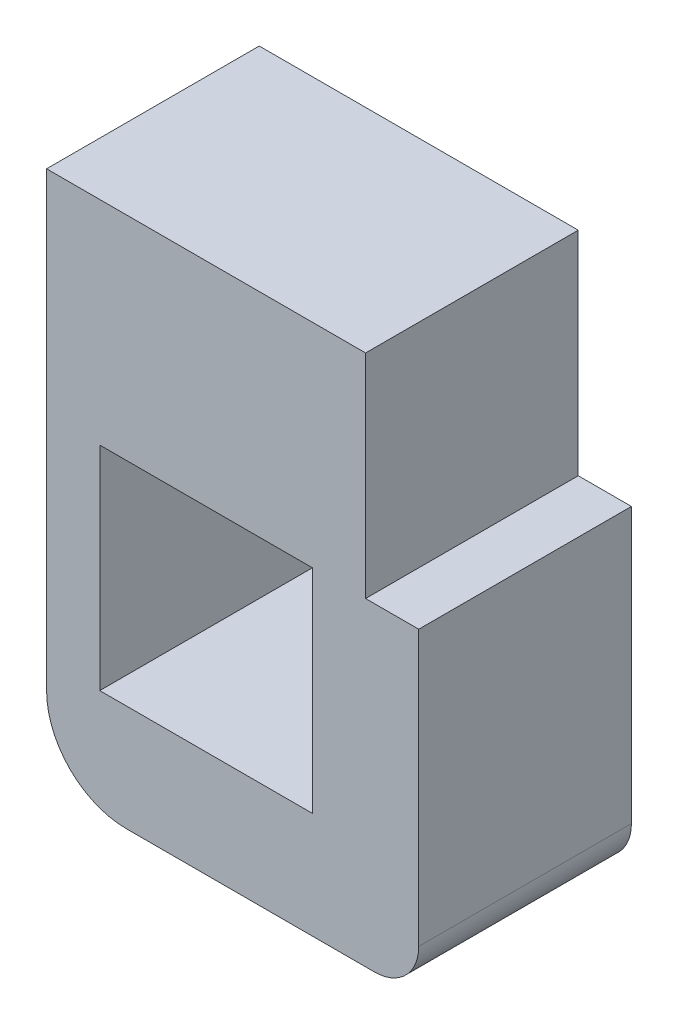
ISO-10303-21;
HEADER;
FILE_DESCRIPTION(('STEP AP214'),'2;1');
FILE_NAME('part.step','',(''),(''),'','','');
FILE_SCHEMA(('AUTOMOTIVE_DESIGN { 1 0 10303 214 1 1 1 1 }'));
ENDSEC;
DATA;
#1=APPLICATION_CONTEXT('core data for automotive mechanical design processes');
#2=APPLICATION_PROTOCOL_DEFINITION('international standard','automotive_design',2000,#1);
#3=PRODUCT_CONTEXT('',#1,'mechanical');
#4=PRODUCT('Part','Part','',(#3));
#5=PRODUCT_RELATED_PRODUCT_CATEGORY('part','',(#4));
#6=PRODUCT_DEFINITION_FORMATION('','',#4);
#7=PRODUCT_DEFINITION_CONTEXT('part definition',#1,'design');
#8=PRODUCT_DEFINITION('design','',#6,#7);
#9=PRODUCT_DEFINITION_SHAPE('','',#8);
#10=(LENGTH_UNIT() NAMED_UNIT(*) SI_UNIT(.MILLI.,.METRE.));
#11=(NAMED_UNIT(*) PLANE_ANGLE_UNIT() SI_UNIT($,.RADIAN.));
#12=(NAMED_UNIT(*) SI_UNIT($,.STERADIAN.) SOLID_ANGLE_UNIT());
#13=UNCERTAINTY_MEASURE_WITH_UNIT(LENGTH_MEASURE(1.E-05),#10,'distance_accuracy_value','');
#14=(GEOMETRIC_REPRESENTATION_CONTEXT(3) GLOBAL_UNCERTAINTY_ASSIGNED_CONTEXT((#13)) GLOBAL_UNIT_ASSIGNED_CONTEXT((#10,
#11,#12)) REPRESENTATION_CONTEXT('',''));
#15=CARTESIAN_POINT('',(0.,0.,0.));
#16=DIRECTION('',(0.,0.,1.));
#17=DIRECTION('',(1.,0.,0.));
#18=AXIS2_PLACEMENT_3D('',#15,#16,#17);
#19=CARTESIAN_POINT('',(6.16666666666667,-9.16666666666667,4.));
#20=DIRECTION('',(0.,0.,-1.));
#21=DIRECTION('',(-1.,0.,0.));
#22=AXIS2_PLACEMENT_3D('',#19,#20,#21);
#23=PLANE('',#22);
#24=DIRECTION('',(0.,-1.,0.));
#25=VECTOR('',#24,1.);
#26=CARTESIAN_POINT('',(0.,-4.,4.));
#27=LINE('',#26,#25);
#28=CARTESIAN_POINT('',(0.,0.,4.));
#29=VERTEX_POINT('',#28);
#30=CARTESIAN_POINT('',(0.,-8.50000000000001,4.));
#31=VERTEX_POINT('',#30);
#32=EDGE_CURVE('E168',#29,#31,#27,.T.);
#33=ORIENTED_EDGE('',*,*,#32,.T.);
#34=CARTESIAN_POINT('',(1.5,-8.50000000000001,4.));
#35=DIRECTION('',(0.,0.,-1.));
#36=DIRECTION('',(-1.,0.,0.));
#37=AXIS2_PLACEMENT_3D('',#34,#35,#36);
#38=CIRCLE('',#37,1.5);
#39=CARTESIAN_POINT('',(1.5,-10.,4.));
#40=VERTEX_POINT('',#39);
#41=EDGE_CURVE('E61',#31,#40,#38,.F.);
#42=ORIENTED_EDGE('',*,*,#41,.T.);
#43=DIRECTION('',(1.,0.,0.));
#44=VECTOR('',#43,1.);
#45=CARTESIAN_POINT('',(6.16666666666667,-10.,4.));
#46=LINE('',#45,#44);
#47=CARTESIAN_POINT('',(6.16666666666667,-10.,4.));
#48=VERTEX_POINT('',#47);
#49=EDGE_CURVE('E170',#40,#48,#46,.T.);
#50=ORIENTED_EDGE('',*,*,#49,.T.);
#51=CARTESIAN_POINT('',(6.16666666666667,-9.16666666666667,4.));
#52=DIRECTION('',(0.,0.,1.));
#53=DIRECTION('',(-1.,0.,0.));
#54=AXIS2_PLACEMENT_3D('',#51,#52,#53);
#55=CIRCLE('',#54,0.833333333333329);
#56=CARTESIAN_POINT('',(7.,-9.16666666666667,4.));
#57=VERTEX_POINT('',#56);
#58=EDGE_CURVE('E173',#48,#57,#55,.T.);
#59=ORIENTED_EDGE('',*,*,#58,.T.);
#60=DIRECTION('',(0.,1.,0.));
#61=VECTOR('',#60,1.);
#62=CARTESIAN_POINT('',(7.,-4.,4.));
#63=LINE('',#62,#61);
#64=CARTESIAN_POINT('',(7.,-4.,4.));
#65=VERTEX_POINT('',#64);
#66=EDGE_CURVE('E175',#57,#65,#63,.T.);
#67=ORIENTED_EDGE('',*,*,#66,.T.);
#68=DIRECTION('',(-1.,0.,0.));
#69=VECTOR('',#68,1.);
#70=CARTESIAN_POINT('',(6.,-4.,4.));
#71=LINE('',#70,#69);
#72=CARTESIAN_POINT('',(6.,-4.,4.));
#73=VERTEX_POINT('',#72);
#74=EDGE_CURVE('E177',#65,#73,#71,.T.);
#75=ORIENTED_EDGE('',*,*,#74,.T.);
#76=DIRECTION('',(0.,1.,0.));
#77=VECTOR('',#76,1.);
#78=CARTESIAN_POINT('',(6.,0.,4.));
#79=LINE('',#78,#77);
#80=CARTESIAN_POINT('',(6.,0.,4.));
#81=VERTEX_POINT('',#80);
#82=EDGE_CURVE('E179',#73,#81,#79,.T.);
#83=ORIENTED_EDGE('',*,*,#82,.T.);
#84=DIRECTION('',(-1.,0.,0.));
#85=VECTOR('',#84,1.);
#86=CARTESIAN_POINT('',(0.,0.,4.));
#87=LINE('',#86,#85);
#88=EDGE_CURVE('E181',#81,#29,#87,.T.);
#89=ORIENTED_EDGE('',*,*,#88,.T.);
#90=EDGE_LOOP('',(#33,#42,#50,#59,#67,#75,#83,#89));
#91=FACE_BOUND('',#90,.T.);
#92=DIRECTION('',(0.,1.,0.));
#93=VECTOR('',#92,1.);
#94=CARTESIAN_POINT('',(5.,-8.,4.));
#95=LINE('',#94,#93);
#96=CARTESIAN_POINT('',(5.,-8.,4.));
#97=VERTEX_POINT('',#96);
#98=CARTESIAN_POINT('',(5.,-4.,4.));
#99=VERTEX_POINT('',#98);
#100=EDGE_CURVE('E127',#97,#99,#95,.T.);
#101=ORIENTED_EDGE('',*,*,#100,.F.);
#102=DIRECTION('',(1.,0.,0.));
#103=VECTOR('',#102,1.);
#104=CARTESIAN_POINT('',(1.,-8.,4.));
#105=LINE('',#104,#103);
#106=CARTESIAN_POINT('',(1.,-8.,4.));
#107=VERTEX_POINT('',#106);
#108=EDGE_CURVE('E152',#107,#97,#105,.T.);
#109=ORIENTED_EDGE('',*,*,#108,.F.);
#110=DIRECTION('',(0.,-1.,0.));
#111=VECTOR('',#110,1.);
#112=CARTESIAN_POINT('',(1.,-8.,4.));
#113=LINE('',#112,#111);
#114=CARTESIAN_POINT('',(1.,-4.,4.));
#115=VERTEX_POINT('',#114);
#116=EDGE_CURVE('E150',#115,#107,#113,.T.);
#117=ORIENTED_EDGE('',*,*,#116,.F.);
#118=DIRECTION('',(-1.,0.,0.));
#119=VECTOR('',#118,1.);
#120=CARTESIAN_POINT('',(1.,-4.,4.));
#121=LINE('',#120,#119);
#122=EDGE_CURVE('E137',#99,#115,#121,.T.);
#123=ORIENTED_EDGE('',*,*,#122,.F.);
#124=EDGE_LOOP('',(#101,#109,#117,#123));
#125=FACE_BOUND('',#124,.T.);
#126=ADVANCED_FACE('F39',(#91,#125),#23,.F.);
#127=CARTESIAN_POINT('',(6.16666666666667,-9.16666666666667,0.));
#128=DIRECTION('',(0.,0.,-1.));
#129=DIRECTION('',(-1.,0.,0.));
#130=AXIS2_PLACEMENT_3D('',#127,#128,#129);
#131=PLANE('',#130);
#132=DIRECTION('',(1.,0.,0.));
#133=VECTOR('',#132,1.);
#134=CARTESIAN_POINT('',(6.16666666666667,-10.,0.));
#135=LINE('',#134,#133);
#136=CARTESIAN_POINT('',(1.5,-10.,0.));
#137=VERTEX_POINT('',#136);
#138=CARTESIAN_POINT('',(6.16666666666667,-10.,0.));
#139=VERTEX_POINT('',#138);
#140=EDGE_CURVE('E186',#137,#139,#135,.T.);
#141=ORIENTED_EDGE('',*,*,#140,.F.);
#142=CARTESIAN_POINT('',(1.5,-8.50000000000001,0.));
#143=DIRECTION('',(0.,0.,-1.));
#144=DIRECTION('',(-1.,0.,0.));
#145=AXIS2_PLACEMENT_3D('',#142,#143,#144);
#146=CIRCLE('',#145,1.5);
#147=CARTESIAN_POINT('',(0.,-8.50000000000001,0.));
#148=VERTEX_POINT('',#147);
#149=EDGE_CURVE('E11',#137,#148,#146,.T.);
#150=ORIENTED_EDGE('',*,*,#149,.T.);
#151=DIRECTION('',(0.,-1.,0.));
#152=VECTOR('',#151,1.);
#153=CARTESIAN_POINT('',(0.,-4.,0.));
#154=LINE('',#153,#152);
#155=CARTESIAN_POINT('',(0.,0.,0.));
#156=VERTEX_POINT('',#155);
#157=EDGE_CURVE('E145',#156,#148,#154,.T.);
#158=ORIENTED_EDGE('',*,*,#157,.F.);
#159=DIRECTION('',(-1.,0.,0.));
#160=VECTOR('',#159,1.);
#161=CARTESIAN_POINT('',(0.,0.,0.));
#162=LINE('',#161,#160);
#163=CARTESIAN_POINT('',(6.,0.,0.));
#164=VERTEX_POINT('',#163);
#165=EDGE_CURVE('E171',#164,#156,#162,.T.);
#166=ORIENTED_EDGE('',*,*,#165,.F.);
#167=DIRECTION('',(0.,1.,0.));
#168=VECTOR('',#167,1.);
#169=CARTESIAN_POINT('',(6.,0.,0.));
#170=LINE('',#169,#168);
#171=CARTESIAN_POINT('',(6.,-4.,0.));
#172=VERTEX_POINT('',#171);
#173=EDGE_CURVE('E194',#172,#164,#170,.T.);
#174=ORIENTED_EDGE('',*,*,#173,.F.);
#175=DIRECTION('',(-1.,0.,0.));
#176=VECTOR('',#175,1.);
#177=CARTESIAN_POINT('',(6.,-4.,0.));
#178=LINE('',#177,#176);
#179=CARTESIAN_POINT('',(7.,-4.,0.));
#180=VERTEX_POINT('',#179);
#181=EDGE_CURVE('E192',#180,#172,#178,.T.);
#182=ORIENTED_EDGE('',*,*,#181,.F.);
#183=DIRECTION('',(0.,1.,0.));
#184=VECTOR('',#183,1.);
#185=CARTESIAN_POINT('',(7.,-4.,0.));
#186=LINE('',#185,#184);
#187=CARTESIAN_POINT('',(7.,-9.16666666666667,0.));
#188=VERTEX_POINT('',#187);
#189=EDGE_CURVE('E190',#188,#180,#186,.T.);
#190=ORIENTED_EDGE('',*,*,#189,.F.);
#191=CARTESIAN_POINT('',(6.16666666666667,-9.16666666666667,0.));
#192=DIRECTION('',(0.,0.,1.));
#193=DIRECTION('',(-1.,0.,0.));
#194=AXIS2_PLACEMENT_3D('',#191,#192,#193);
#195=CIRCLE('',#194,0.833333333333329);
#196=EDGE_CURVE('E188',#139,#188,#195,.T.);
#197=ORIENTED_EDGE('',*,*,#196,.F.);
#198=EDGE_LOOP('',(#141,#150,#158,#166,#174,#182,#190,#197));
#199=FACE_BOUND('',#198,.T.);
#200=DIRECTION('',(1.,0.,0.));
#201=VECTOR('',#200,1.);
#202=CARTESIAN_POINT('',(1.,-8.,0.));
#203=LINE('',#202,#201);
#204=CARTESIAN_POINT('',(1.,-8.,0.));
#205=VERTEX_POINT('',#204);
#206=CARTESIAN_POINT('',(5.,-8.,0.));
#207=VERTEX_POINT('',#206);
#208=EDGE_CURVE('E138',#205,#207,#203,.T.);
#209=ORIENTED_EDGE('',*,*,#208,.T.);
#210=DIRECTION('',(0.,1.,0.));
#211=VECTOR('',#210,1.);
#212=CARTESIAN_POINT('',(5.,-8.,0.));
#213=LINE('',#212,#211);
#214=CARTESIAN_POINT('',(5.,-4.,0.));
#215=VERTEX_POINT('',#214);
#216=EDGE_CURVE('E156',#207,#215,#213,.T.);
#217=ORIENTED_EDGE('',*,*,#216,.T.);
#218=DIRECTION('',(-1.,0.,0.));
#219=VECTOR('',#218,1.);
#220=CARTESIAN_POINT('',(1.,-4.,0.));
#221=LINE('',#220,#219);
#222=CARTESIAN_POINT('',(1.,-4.,0.));
#223=VERTEX_POINT('',#222);
#224=EDGE_CURVE('E144',#215,#223,#221,.T.);
#225=ORIENTED_EDGE('',*,*,#224,.T.);
#226=DIRECTION('',(0.,-1.,0.));
#227=VECTOR('',#226,1.);
#228=CARTESIAN_POINT('',(1.,-8.,0.));
#229=LINE('',#228,#227);
#230=EDGE_CURVE('E159',#223,#205,#229,.T.);
#231=ORIENTED_EDGE('',*,*,#230,.T.);
#232=EDGE_LOOP('',(#209,#217,#225,#231));
#233=FACE_BOUND('',#232,.T.);
#234=ADVANCED_FACE('F232',(#199,#233),#131,.T.);
#235=CARTESIAN_POINT('',(0.,-4.,4.));
#236=DIRECTION('',(1.,0.,0.));
#237=DIRECTION('',(0.,0.,-1.));
#238=AXIS2_PLACEMENT_3D('',#235,#236,#237);
#239=PLANE('',#238);
#240=ORIENTED_EDGE('',*,*,#157,.T.);
#241=DIRECTION('',(0.,0.,1.));
#242=VECTOR('',#241,1.);
#243=CARTESIAN_POINT('',(0.,-8.50000000000001,4.));
#244=LINE('',#243,#242);
#245=EDGE_CURVE('E214',#148,#31,#244,.T.);
#246=ORIENTED_EDGE('',*,*,#245,.T.);
#247=ORIENTED_EDGE('',*,*,#32,.F.);
#248=DIRECTION('',(0.,0.,-1.));
#249=VECTOR('',#248,1.);
#250=CARTESIAN_POINT('',(0.,0.,4.));
#251=LINE('',#250,#249);
#252=EDGE_CURVE('E183',#29,#156,#251,.T.);
#253=ORIENTED_EDGE('',*,*,#252,.T.);
#254=EDGE_LOOP('',(#240,#246,#247,#253));
#255=FACE_BOUND('',#254,.T.);
#256=ADVANCED_FACE('F220',(#255),#239,.F.);
#257=CARTESIAN_POINT('',(6.16666666666667,-10.,4.));
#258=DIRECTION('',(0.,1.,0.));
#259=DIRECTION('',(0.,0.,1.));
#260=AXIS2_PLACEMENT_3D('',#257,#258,#259);
#261=PLANE('',#260);
#262=ORIENTED_EDGE('',*,*,#49,.F.);
#263=DIRECTION('',(0.,0.,1.));
#264=VECTOR('',#263,1.);
#265=CARTESIAN_POINT('',(1.5,-10.,4.));
#266=LINE('',#265,#264);
#267=EDGE_CURVE('E47',#40,#137,#266,.F.);
#268=ORIENTED_EDGE('',*,*,#267,.T.);
#269=ORIENTED_EDGE('',*,*,#140,.T.);
#270=DIRECTION('',(0.,0.,-1.));
#271=VECTOR('',#270,1.);
#272=CARTESIAN_POINT('',(6.16666666666667,-10.,4.));
#273=LINE('',#272,#271);
#274=EDGE_CURVE('E211',#48,#139,#273,.T.);
#275=ORIENTED_EDGE('',*,*,#274,.F.);
#276=EDGE_LOOP('',(#262,#268,#269,#275));
#277=FACE_BOUND('',#276,.T.);
#278=ADVANCED_FACE('F271',(#277),#261,.F.);
#279=CARTESIAN_POINT('',(6.16666666666667,-9.16666666666667,4.));
#280=DIRECTION('',(0.,0.,-1.));
#281=DIRECTION('',(-1.,0.,0.));
#282=AXIS2_PLACEMENT_3D('',#279,#280,#281);
#283=CYLINDRICAL_SURFACE('',#282,0.833333333333329);
#284=ORIENTED_EDGE('',*,*,#196,.T.);
#285=DIRECTION('',(0.,0.,-1.));
#286=VECTOR('',#285,1.);
#287=CARTESIAN_POINT('',(7.,-9.16666666666667,4.));
#288=LINE('',#287,#286);
#289=EDGE_CURVE('E208',#57,#188,#288,.T.);
#290=ORIENTED_EDGE('',*,*,#289,.F.);
#291=ORIENTED_EDGE('',*,*,#58,.F.);
#292=ORIENTED_EDGE('',*,*,#274,.T.);
#293=EDGE_LOOP('',(#284,#290,#291,#292));
#294=FACE_BOUND('',#293,.T.);
#295=ADVANCED_FACE('F267',(#294),#283,.T.);
#296=CARTESIAN_POINT('',(7.,-4.,4.));
#297=DIRECTION('',(-1.,0.,0.));
#298=DIRECTION('',(0.,-1.,0.));
#299=AXIS2_PLACEMENT_3D('',#296,#297,#298);
#300=PLANE('',#299);
#301=ORIENTED_EDGE('',*,*,#189,.T.);
#302=DIRECTION('',(0.,0.,-1.));
#303=VECTOR('',#302,1.);
#304=CARTESIAN_POINT('',(7.,-4.,4.));
#305=LINE('',#304,#303);
#306=EDGE_CURVE('E205',#65,#180,#305,.T.);
#307=ORIENTED_EDGE('',*,*,#306,.F.);
#308=ORIENTED_EDGE('',*,*,#66,.F.);
#309=ORIENTED_EDGE('',*,*,#289,.T.);
#310=EDGE_LOOP('',(#301,#307,#308,#309));
#311=FACE_BOUND('',#310,.T.);
#312=ADVANCED_FACE('F263',(#311),#300,.F.);
#313=CARTESIAN_POINT('',(6.,-4.,4.));
#314=DIRECTION('',(0.,-1.,0.));
#315=DIRECTION('',(0.,0.,-1.));
#316=AXIS2_PLACEMENT_3D('',#313,#314,#315);
#317=PLANE('',#316);
#318=ORIENTED_EDGE('',*,*,#181,.T.);
#319=DIRECTION('',(0.,0.,-1.));
#320=VECTOR('',#319,1.);
#321=CARTESIAN_POINT('',(6.,-4.,4.));
#322=LINE('',#321,#320);
#323=EDGE_CURVE('E202',#73,#172,#322,.T.);
#324=ORIENTED_EDGE('',*,*,#323,.F.);
#325=ORIENTED_EDGE('',*,*,#74,.F.);
#326=ORIENTED_EDGE('',*,*,#306,.T.);
#327=EDGE_LOOP('',(#318,#324,#325,#326));
#328=FACE_BOUND('',#327,.T.);
#329=ADVANCED_FACE('F259',(#328),#317,.F.);
#330=CARTESIAN_POINT('',(6.,0.,4.));
#331=DIRECTION('',(-1.,0.,0.));
#332=DIRECTION('',(0.,-1.,0.));
#333=AXIS2_PLACEMENT_3D('',#330,#331,#332);
#334=PLANE('',#333);
#335=ORIENTED_EDGE('',*,*,#173,.T.);
#336=DIRECTION('',(0.,0.,-1.));
#337=VECTOR('',#336,1.);
#338=CARTESIAN_POINT('',(6.,0.,4.));
#339=LINE('',#338,#337);
#340=EDGE_CURVE('E199',#81,#164,#339,.T.);
#341=ORIENTED_EDGE('',*,*,#340,.F.);
#342=ORIENTED_EDGE('',*,*,#82,.F.);
#343=ORIENTED_EDGE('',*,*,#323,.T.);
#344=EDGE_LOOP('',(#335,#341,#342,#343));
#345=FACE_BOUND('',#344,.T.);
#346=ADVANCED_FACE('F256',(#345),#334,.F.);
#347=CARTESIAN_POINT('',(0.,0.,4.));
#348=DIRECTION('',(0.,-1.,0.));
#349=DIRECTION('',(1.,0.,0.));
#350=AXIS2_PLACEMENT_3D('',#347,#348,#349);
#351=PLANE('',#350);
#352=ORIENTED_EDGE('',*,*,#165,.T.);
#353=ORIENTED_EDGE('',*,*,#252,.F.);
#354=ORIENTED_EDGE('',*,*,#88,.F.);
#355=ORIENTED_EDGE('',*,*,#340,.T.);
#356=EDGE_LOOP('',(#352,#353,#354,#355));
#357=FACE_BOUND('',#356,.T.);
#358=ADVANCED_FACE('F229',(#357),#351,.F.);
#359=CARTESIAN_POINT('',(5.,-8.,4.));
#360=DIRECTION('',(-1.,0.,0.));
#361=DIRECTION('',(0.,0.,1.));
#362=AXIS2_PLACEMENT_3D('',#359,#360,#361);
#363=PLANE('',#362);
#364=ORIENTED_EDGE('',*,*,#216,.F.);
#365=DIRECTION('',(0.,0.,-1.));
#366=VECTOR('',#365,1.);
#367=CARTESIAN_POINT('',(5.,-8.,4.));
#368=LINE('',#367,#366);
#369=EDGE_CURVE('E133',#97,#207,#368,.T.);
#370=ORIENTED_EDGE('',*,*,#369,.F.);
#371=ORIENTED_EDGE('',*,*,#100,.T.);
#372=DIRECTION('',(0.,0.,-1.));
#373=VECTOR('',#372,1.);
#374=CARTESIAN_POINT('',(5.,-4.,4.));
#375=LINE('',#374,#373);
#376=EDGE_CURVE('E130',#99,#215,#375,.T.);
#377=ORIENTED_EDGE('',*,*,#376,.T.);
#378=EDGE_LOOP('',(#364,#370,#371,#377));
#379=FACE_BOUND('',#378,.T.);
#380=ADVANCED_FACE('F129',(#379),#363,.T.);
#381=CARTESIAN_POINT('',(1.,-4.,4.));
#382=DIRECTION('',(0.,-1.,0.));
#383=DIRECTION('',(0.,0.,-1.));
#384=AXIS2_PLACEMENT_3D('',#381,#382,#383);
#385=PLANE('',#384);
#386=ORIENTED_EDGE('',*,*,#224,.F.);
#387=ORIENTED_EDGE('',*,*,#376,.F.);
#388=ORIENTED_EDGE('',*,*,#122,.T.);
#389=DIRECTION('',(0.,0.,-1.));
#390=VECTOR('',#389,1.);
#391=CARTESIAN_POINT('',(1.,-4.,4.));
#392=LINE('',#391,#390);
#393=EDGE_CURVE('E146',#115,#223,#392,.T.);
#394=ORIENTED_EDGE('',*,*,#393,.T.);
#395=EDGE_LOOP('',(#386,#387,#388,#394));
#396=FACE_BOUND('',#395,.T.);
#397=ADVANCED_FACE('F141',(#396),#385,.T.);
#398=CARTESIAN_POINT('',(1.,-8.,4.));
#399=DIRECTION('',(1.,0.,0.));
#400=DIRECTION('',(0.,0.,-1.));
#401=AXIS2_PLACEMENT_3D('',#398,#399,#400);
#402=PLANE('',#401);
#403=ORIENTED_EDGE('',*,*,#230,.F.);
#404=ORIENTED_EDGE('',*,*,#393,.F.);
#405=ORIENTED_EDGE('',*,*,#116,.T.);
#406=DIRECTION('',(0.,0.,-1.));
#407=VECTOR('',#406,1.);
#408=CARTESIAN_POINT('',(1.,-8.,4.));
#409=LINE('',#408,#407);
#410=EDGE_CURVE('E165',#107,#205,#409,.T.);
#411=ORIENTED_EDGE('',*,*,#410,.T.);
#412=EDGE_LOOP('',(#403,#404,#405,#411));
#413=FACE_BOUND('',#412,.T.);
#414=ADVANCED_FACE('F242',(#413),#402,.T.);
#415=CARTESIAN_POINT('',(1.,-8.,4.));
#416=DIRECTION('',(0.,1.,0.));
#417=DIRECTION('',(0.,0.,1.));
#418=AXIS2_PLACEMENT_3D('',#415,#416,#417);
#419=PLANE('',#418);
#420=ORIENTED_EDGE('',*,*,#208,.F.);
#421=ORIENTED_EDGE('',*,*,#410,.F.);
#422=ORIENTED_EDGE('',*,*,#108,.T.);
#423=ORIENTED_EDGE('',*,*,#369,.T.);
#424=EDGE_LOOP('',(#420,#421,#422,#423));
#425=FACE_BOUND('',#424,.T.);
#426=ADVANCED_FACE('F237',(#425),#419,.T.);
#427=CARTESIAN_POINT('',(1.5,-8.50000000000001,4.));
#428=DIRECTION('',(0.,0.,1.));
#429=DIRECTION('',(1.,0.,0.));
#430=AXIS2_PLACEMENT_3D('',#427,#428,#429);
#431=CYLINDRICAL_SURFACE('',#430,1.5);
#432=ORIENTED_EDGE('',*,*,#149,.F.);
#433=ORIENTED_EDGE('',*,*,#267,.F.);
#434=ORIENTED_EDGE('',*,*,#41,.F.);
#435=ORIENTED_EDGE('',*,*,#245,.F.);
#436=EDGE_LOOP('',(#432,#433,#434,#435));
#437=FACE_BOUND('',#436,.T.);
#438=ADVANCED_FACE('F41',(#437),#431,.T.);
#439=CLOSED_SHELL('',(#126,#234,#256,#278,#295,#312,#329,#346,#358,#380,#397,#414,#426,#438));
#440=MANIFOLD_SOLID_BREP('B2',#439);
#441=ADVANCED_BREP_SHAPE_REPRESENTATION('',(#18,#440),#14);
#442=SHAPE_DEFINITION_REPRESENTATION(#9,#441);
ENDSEC;
END-ISO-10303-21;
